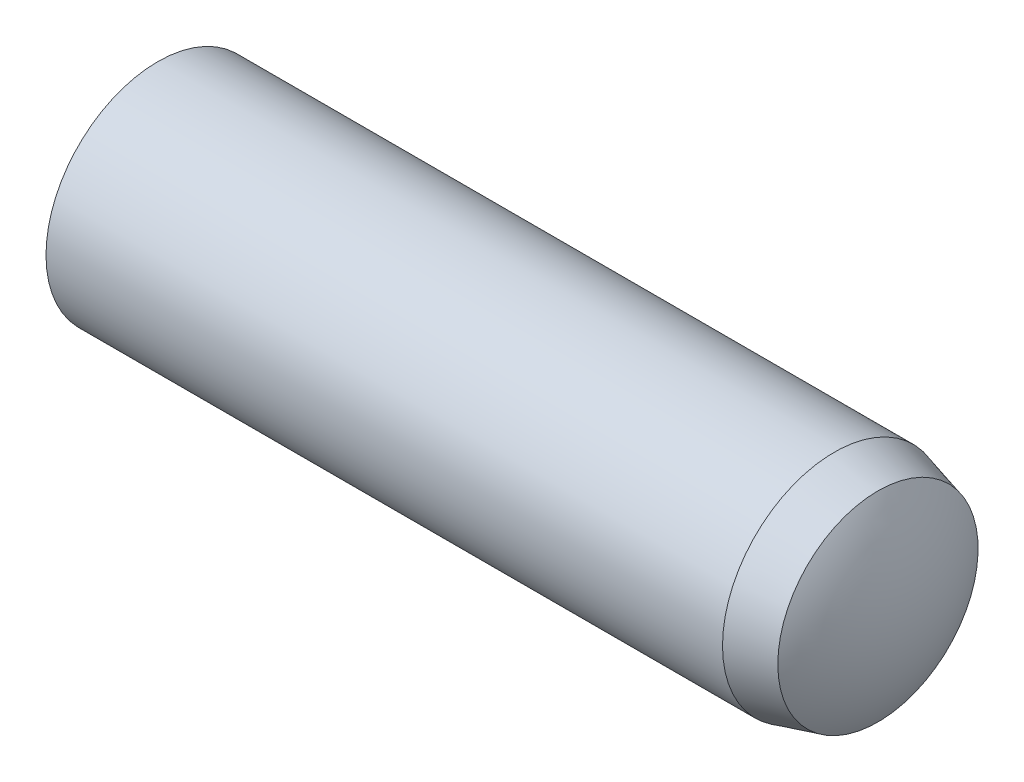
ISO-10303-21;
HEADER;
FILE_DESCRIPTION(('STEP AP214'),'2;1');
FILE_NAME('part.step','',(''),(''),'','','');
FILE_SCHEMA(('AUTOMOTIVE_DESIGN { 1 0 10303 214 1 1 1 1 }'));
ENDSEC;
DATA;
#1=APPLICATION_CONTEXT('core data for automotive mechanical design processes');
#2=APPLICATION_PROTOCOL_DEFINITION('international standard','automotive_design',2000,#1);
#3=PRODUCT_CONTEXT('',#1,'mechanical');
#4=PRODUCT('Part','Part','',(#3));
#5=PRODUCT_RELATED_PRODUCT_CATEGORY('part','',(#4));
#6=PRODUCT_DEFINITION_FORMATION('','',#4);
#7=PRODUCT_DEFINITION_CONTEXT('part definition',#1,'design');
#8=PRODUCT_DEFINITION('design','',#6,#7);
#9=PRODUCT_DEFINITION_SHAPE('','',#8);
#10=(LENGTH_UNIT() NAMED_UNIT(*) SI_UNIT(.MILLI.,.METRE.));
#11=(NAMED_UNIT(*) PLANE_ANGLE_UNIT() SI_UNIT($,.RADIAN.));
#12=(NAMED_UNIT(*) SI_UNIT($,.STERADIAN.) SOLID_ANGLE_UNIT());
#13=UNCERTAINTY_MEASURE_WITH_UNIT(LENGTH_MEASURE(1.E-05),#10,'distance_accuracy_value','');
#14=(GEOMETRIC_REPRESENTATION_CONTEXT(3) GLOBAL_UNCERTAINTY_ASSIGNED_CONTEXT((#13)) GLOBAL_UNIT_ASSIGNED_CONTEXT((#10,
#11,#12)) REPRESENTATION_CONTEXT('',''));
#15=CARTESIAN_POINT('',(0.,0.,0.));
#16=DIRECTION('',(0.,0.,1.));
#17=DIRECTION('',(1.,0.,0.));
#18=AXIS2_PLACEMENT_3D('',#15,#16,#17);
#19=CARTESIAN_POINT('',(-3.5,0.,0.));
#20=DIRECTION('',(1.,0.,0.));
#21=DIRECTION('',(0.,0.,-1.));
#22=AXIS2_PLACEMENT_3D('',#19,#20,#21);
#23=CYLINDRICAL_SURFACE('',#22,1.);
#24=CARTESIAN_POINT('',(2.85,0.,0.));
#25=DIRECTION('',(-1.,0.,0.));
#26=DIRECTION('',(0.,0.,1.));
#27=AXIS2_PLACEMENT_3D('',#24,#25,#26);
#28=CIRCLE('',#27,1.);
#29=CARTESIAN_POINT('',(2.85,0.,1.));
#30=VERTEX_POINT('',#29);
#31=EDGE_CURVE('E11',#30,#30,#28,.T.);
#32=ORIENTED_EDGE('',*,*,#31,.T.);
#33=EDGE_LOOP('',(#32));
#34=FACE_BOUND('',#33,.T.);
#35=CARTESIAN_POINT('',(-3.2,0.,0.));
#36=DIRECTION('',(-1.,0.,0.));
#37=DIRECTION('',(0.,0.,1.));
#38=AXIS2_PLACEMENT_3D('',#35,#36,#37);
#39=CIRCLE('',#38,1.);
#40=CARTESIAN_POINT('',(-3.2,0.,1.));
#41=VERTEX_POINT('',#40);
#42=EDGE_CURVE('E60',#41,#41,#39,.T.);
#43=ORIENTED_EDGE('',*,*,#42,.F.);
#44=EDGE_LOOP('',(#43));
#45=FACE_BOUND('',#44,.T.);
#46=ADVANCED_FACE('F39',(#34,#45),#23,.T.);
#47=CARTESIAN_POINT('',(2.85,0.,0.));
#48=DIRECTION('',(-1.,0.,0.));
#49=DIRECTION('',(0.,0.,1.));
#50=AXIS2_PLACEMENT_3D('',#47,#48,#49);
#51=CONICAL_SURFACE('',#50,1.,0.26179938779915);
#52=CARTESIAN_POINT('',(3.24,0.,0.));
#53=DIRECTION('',(-1.,0.,0.));
#54=DIRECTION('',(0.,0.,1.));
#55=AXIS2_PLACEMENT_3D('',#52,#53,#54);
#56=CIRCLE('',#55,0.895499814951861);
#57=CARTESIAN_POINT('',(3.24,0.,0.895499814951861));
#58=VERTEX_POINT('',#57);
#59=EDGE_CURVE('E47',#58,#58,#56,.T.);
#60=ORIENTED_EDGE('',*,*,#59,.T.);
#61=EDGE_LOOP('',(#60));
#62=FACE_BOUND('',#61,.T.);
#63=ORIENTED_EDGE('',*,*,#31,.F.);
#64=EDGE_LOOP('',(#63));
#65=FACE_BOUND('',#64,.T.);
#66=ADVANCED_FACE('F68',(#62,#65),#51,.T.);
#67=CARTESIAN_POINT('',(1.82784631042533,0.,0.));
#68=DIRECTION('',(-1.,0.,0.));
#69=DIRECTION('',(0.,1.,0.));
#70=AXIS2_PLACEMENT_3D('',#67,#68,#69);
#71=SPHERICAL_SURFACE('',#70,1.67215368957467);
#72=CARTESIAN_POINT('',(3.5,0.,0.));
#73=VERTEX_POINT('',#72);
#74=VERTEX_LOOP('',#73);
#75=FACE_BOUND('',#74,.T.);
#76=ORIENTED_EDGE('',*,*,#59,.F.);
#77=EDGE_LOOP('',(#76));
#78=FACE_BOUND('',#77,.T.);
#79=ADVANCED_FACE('F56',(#75,#78),#71,.T.);
#80=CARTESIAN_POINT('',(-1.68333333333333,0.,0.));
#81=DIRECTION('',(-1.,0.,0.));
#82=DIRECTION('',(0.,1.,0.));
#83=AXIS2_PLACEMENT_3D('',#80,#81,#82);
#84=SPHERICAL_SURFACE('',#83,1.81666666666667);
#85=CARTESIAN_POINT('',(-3.5,0.,0.));
#86=VERTEX_POINT('',#85);
#87=VERTEX_LOOP('',#86);
#88=FACE_BOUND('',#87,.T.);
#89=ORIENTED_EDGE('',*,*,#42,.T.);
#90=EDGE_LOOP('',(#89));
#91=FACE_BOUND('',#90,.T.);
#92=ADVANCED_FACE('F53',(#88,#91),#84,.T.);
#93=CLOSED_SHELL('',(#46,#66,#79,#92));
#94=MANIFOLD_SOLID_BREP('B2',#93);
#95=ADVANCED_BREP_SHAPE_REPRESENTATION('',(#18,#94),#14);
#96=SHAPE_DEFINITION_REPRESENTATION(#9,#95);
ENDSEC;
END-ISO-10303-21;
